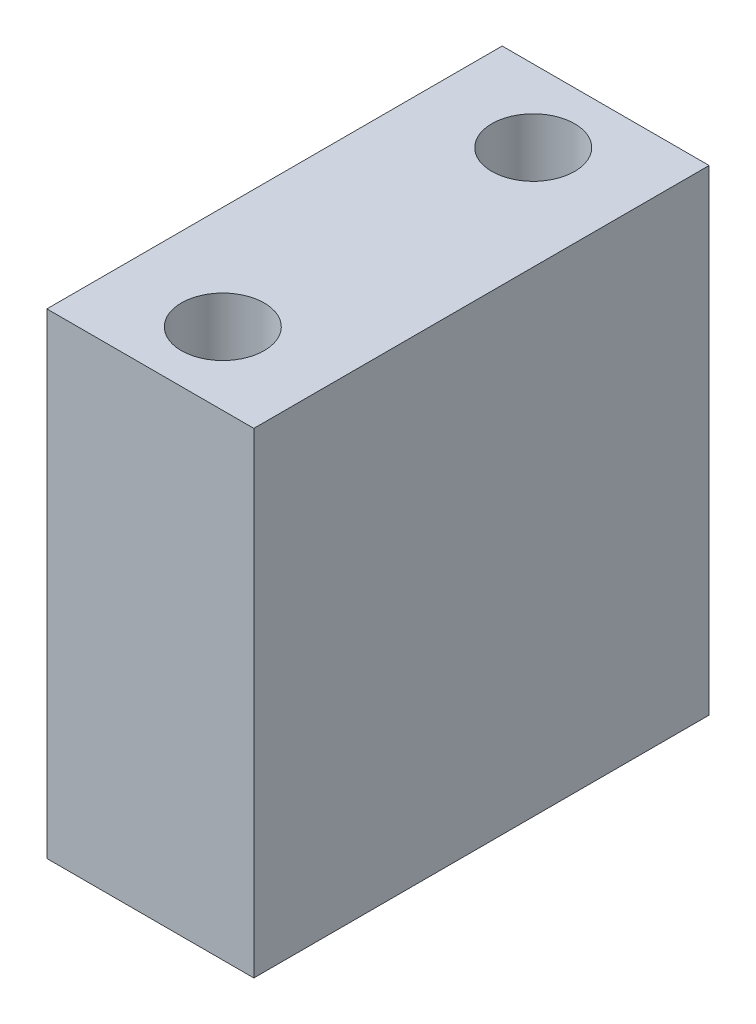
ISO-10303-21;
HEADER;
FILE_DESCRIPTION(('STEP AP214'),'2;1');
FILE_NAME('part.step','',(''),(''),'','','');
FILE_SCHEMA(('AUTOMOTIVE_DESIGN { 1 0 10303 214 1 1 1 1 }'));
ENDSEC;
DATA;
#1=APPLICATION_CONTEXT('core data for automotive mechanical design processes');
#2=APPLICATION_PROTOCOL_DEFINITION('international standard','automotive_design',2000,#1);
#3=PRODUCT_CONTEXT('',#1,'mechanical');
#4=PRODUCT('Part','Part','',(#3));
#5=PRODUCT_RELATED_PRODUCT_CATEGORY('part','',(#4));
#6=PRODUCT_DEFINITION_FORMATION('','',#4);
#7=PRODUCT_DEFINITION_CONTEXT('part definition',#1,'design');
#8=PRODUCT_DEFINITION('design','',#6,#7);
#9=PRODUCT_DEFINITION_SHAPE('','',#8);
#10=(LENGTH_UNIT() NAMED_UNIT(*) SI_UNIT(.MILLI.,.METRE.));
#11=(NAMED_UNIT(*) PLANE_ANGLE_UNIT() SI_UNIT($,.RADIAN.));
#12=(NAMED_UNIT(*) SI_UNIT($,.STERADIAN.) SOLID_ANGLE_UNIT());
#13=UNCERTAINTY_MEASURE_WITH_UNIT(LENGTH_MEASURE(1.E-05),#10,'distance_accuracy_value','');
#14=(GEOMETRIC_REPRESENTATION_CONTEXT(3) GLOBAL_UNCERTAINTY_ASSIGNED_CONTEXT((#13)) GLOBAL_UNIT_ASSIGNED_CONTEXT((#10,
#11,#12)) REPRESENTATION_CONTEXT('',''));
#15=CARTESIAN_POINT('',(0.,0.,0.));
#16=DIRECTION('',(0.,0.,1.));
#17=DIRECTION('',(1.,0.,0.));
#18=AXIS2_PLACEMENT_3D('',#15,#16,#17);
#19=CARTESIAN_POINT('',(0.,23.,0.));
#20=DIRECTION('',(0.,1.,0.));
#21=DIRECTION('',(0.,0.,1.));
#22=AXIS2_PLACEMENT_3D('',#19,#20,#21);
#23=PLANE('',#22);
#24=CARTESIAN_POINT('',(0.,23.,-7.49999999999999));
#25=DIRECTION('',(0.,1.,0.));
#26=DIRECTION('',(0.,0.,1.));
#27=AXIS2_PLACEMENT_3D('',#24,#25,#26);
#28=CIRCLE('',#27,2.);
#29=CARTESIAN_POINT('',(0.,23.,-5.49999999999999));
#30=VERTEX_POINT('',#29);
#31=EDGE_CURVE('E112',#30,#30,#28,.T.);
#32=ORIENTED_EDGE('',*,*,#31,.F.);
#33=EDGE_LOOP('',(#32));
#34=FACE_BOUND('',#33,.T.);
#35=DIRECTION('',(0.,0.,-1.));
#36=VECTOR('',#35,1.);
#37=CARTESIAN_POINT('',(5.,23.,-11.));
#38=LINE('',#37,#36);
#39=CARTESIAN_POINT('',(5.,23.,11.));
#40=VERTEX_POINT('',#39);
#41=CARTESIAN_POINT('',(5.,23.,-11.));
#42=VERTEX_POINT('',#41);
#43=EDGE_CURVE('E92',#40,#42,#38,.T.);
#44=ORIENTED_EDGE('',*,*,#43,.T.);
#45=DIRECTION('',(-1.,0.,0.));
#46=VECTOR('',#45,1.);
#47=CARTESIAN_POINT('',(-5.,23.,-11.));
#48=LINE('',#47,#46);
#49=CARTESIAN_POINT('',(-5.,23.,-11.));
#50=VERTEX_POINT('',#49);
#51=EDGE_CURVE('E87',#42,#50,#48,.T.);
#52=ORIENTED_EDGE('',*,*,#51,.T.);
#53=DIRECTION('',(0.,0.,1.));
#54=VECTOR('',#53,1.);
#55=CARTESIAN_POINT('',(-5.,23.,-11.));
#56=LINE('',#55,#54);
#57=CARTESIAN_POINT('',(-5.,23.,11.));
#58=VERTEX_POINT('',#57);
#59=EDGE_CURVE('E90',#50,#58,#56,.T.);
#60=ORIENTED_EDGE('',*,*,#59,.T.);
#61=DIRECTION('',(1.,0.,0.));
#62=VECTOR('',#61,1.);
#63=CARTESIAN_POINT('',(-5.,23.,11.));
#64=LINE('',#63,#62);
#65=EDGE_CURVE('E57',#58,#40,#64,.T.);
#66=ORIENTED_EDGE('',*,*,#65,.T.);
#67=EDGE_LOOP('',(#44,#52,#60,#66));
#68=FACE_BOUND('',#67,.T.);
#69=CARTESIAN_POINT('',(0.,23.,7.5));
#70=DIRECTION('',(0.,1.,0.));
#71=DIRECTION('',(0.,0.,1.));
#72=AXIS2_PLACEMENT_3D('',#69,#70,#71);
#73=CIRCLE('',#72,2.);
#74=CARTESIAN_POINT('',(0.,23.,9.5));
#75=VERTEX_POINT('',#74);
#76=EDGE_CURVE('E134',#75,#75,#73,.T.);
#77=ORIENTED_EDGE('',*,*,#76,.F.);
#78=EDGE_LOOP('',(#77));
#79=FACE_BOUND('',#78,.T.);
#80=ADVANCED_FACE('F39',(#34,#68,#79),#23,.T.);
#81=CARTESIAN_POINT('',(0.,0.,0.));
#82=DIRECTION('',(0.,1.,0.));
#83=DIRECTION('',(0.,0.,1.));
#84=AXIS2_PLACEMENT_3D('',#81,#82,#83);
#85=PLANE('',#84);
#86=DIRECTION('',(0.,0.,-1.));
#87=VECTOR('',#86,1.);
#88=CARTESIAN_POINT('',(5.,0.,-11.));
#89=LINE('',#88,#87);
#90=CARTESIAN_POINT('',(5.,0.,11.));
#91=VERTEX_POINT('',#90);
#92=CARTESIAN_POINT('',(5.,0.,-11.));
#93=VERTEX_POINT('',#92);
#94=EDGE_CURVE('E108',#91,#93,#89,.T.);
#95=ORIENTED_EDGE('',*,*,#94,.F.);
#96=DIRECTION('',(1.,0.,0.));
#97=VECTOR('',#96,1.);
#98=CARTESIAN_POINT('',(-5.,0.,11.));
#99=LINE('',#98,#97);
#100=CARTESIAN_POINT('',(-5.,0.,11.));
#101=VERTEX_POINT('',#100);
#102=EDGE_CURVE('E80',#101,#91,#99,.T.);
#103=ORIENTED_EDGE('',*,*,#102,.F.);
#104=DIRECTION('',(0.,0.,1.));
#105=VECTOR('',#104,1.);
#106=CARTESIAN_POINT('',(-5.,0.,-11.));
#107=LINE('',#106,#105);
#108=CARTESIAN_POINT('',(-5.,0.,-11.));
#109=VERTEX_POINT('',#108);
#110=EDGE_CURVE('E74',#109,#101,#107,.T.);
#111=ORIENTED_EDGE('',*,*,#110,.F.);
#112=DIRECTION('',(-1.,0.,0.));
#113=VECTOR('',#112,1.);
#114=CARTESIAN_POINT('',(-5.,0.,-11.));
#115=LINE('',#114,#113);
#116=EDGE_CURVE('E97',#93,#109,#115,.T.);
#117=ORIENTED_EDGE('',*,*,#116,.F.);
#118=EDGE_LOOP('',(#95,#103,#111,#117));
#119=FACE_BOUND('',#118,.T.);
#120=CARTESIAN_POINT('',(0.,0.,-7.49999999999999));
#121=DIRECTION('',(0.,1.,0.));
#122=DIRECTION('',(0.,0.,1.));
#123=AXIS2_PLACEMENT_3D('',#120,#121,#122);
#124=CIRCLE('',#123,2.);
#125=CARTESIAN_POINT('',(0.,0.,-5.49999999999999));
#126=VERTEX_POINT('',#125);
#127=EDGE_CURVE('E130',#126,#126,#124,.T.);
#128=ORIENTED_EDGE('',*,*,#127,.T.);
#129=EDGE_LOOP('',(#128));
#130=FACE_BOUND('',#129,.T.);
#131=CARTESIAN_POINT('',(0.,0.,7.5));
#132=DIRECTION('',(0.,1.,0.));
#133=DIRECTION('',(0.,0.,1.));
#134=AXIS2_PLACEMENT_3D('',#131,#132,#133);
#135=CIRCLE('',#134,2.);
#136=CARTESIAN_POINT('',(0.,0.,9.5));
#137=VERTEX_POINT('',#136);
#138=EDGE_CURVE('E138',#137,#137,#135,.T.);
#139=ORIENTED_EDGE('',*,*,#138,.T.);
#140=EDGE_LOOP('',(#139));
#141=FACE_BOUND('',#140,.T.);
#142=ADVANCED_FACE('F125',(#119,#130,#141),#85,.F.);
#143=CARTESIAN_POINT('',(5.,23.,-11.));
#144=DIRECTION('',(-1.,0.,0.));
#145=DIRECTION('',(0.,0.,1.));
#146=AXIS2_PLACEMENT_3D('',#143,#144,#145);
#147=PLANE('',#146);
#148=ORIENTED_EDGE('',*,*,#94,.T.);
#149=DIRECTION('',(0.,-1.,0.));
#150=VECTOR('',#149,1.);
#151=CARTESIAN_POINT('',(5.,23.,-11.));
#152=LINE('',#151,#150);
#153=EDGE_CURVE('E11',#42,#93,#152,.T.);
#154=ORIENTED_EDGE('',*,*,#153,.F.);
#155=ORIENTED_EDGE('',*,*,#43,.F.);
#156=DIRECTION('',(0.,-1.,0.));
#157=VECTOR('',#156,1.);
#158=CARTESIAN_POINT('',(5.,23.,11.));
#159=LINE('',#158,#157);
#160=EDGE_CURVE('E104',#40,#91,#159,.T.);
#161=ORIENTED_EDGE('',*,*,#160,.T.);
#162=EDGE_LOOP('',(#148,#154,#155,#161));
#163=FACE_BOUND('',#162,.T.);
#164=ADVANCED_FACE('F41',(#163),#147,.F.);
#165=CARTESIAN_POINT('',(-5.,23.,-11.));
#166=DIRECTION('',(0.,0.,1.));
#167=DIRECTION('',(1.,0.,0.));
#168=AXIS2_PLACEMENT_3D('',#165,#166,#167);
#169=PLANE('',#168);
#170=ORIENTED_EDGE('',*,*,#116,.T.);
#171=DIRECTION('',(0.,-1.,0.));
#172=VECTOR('',#171,1.);
#173=CARTESIAN_POINT('',(-5.,23.,-11.));
#174=LINE('',#173,#172);
#175=EDGE_CURVE('E49',#50,#109,#174,.T.);
#176=ORIENTED_EDGE('',*,*,#175,.F.);
#177=ORIENTED_EDGE('',*,*,#51,.F.);
#178=ORIENTED_EDGE('',*,*,#153,.T.);
#179=EDGE_LOOP('',(#170,#176,#177,#178));
#180=FACE_BOUND('',#179,.T.);
#181=ADVANCED_FACE('F96',(#180),#169,.F.);
#182=CARTESIAN_POINT('',(-5.,23.,-11.));
#183=DIRECTION('',(1.,0.,0.));
#184=DIRECTION('',(0.,0.,-1.));
#185=AXIS2_PLACEMENT_3D('',#182,#183,#184);
#186=PLANE('',#185);
#187=ORIENTED_EDGE('',*,*,#110,.T.);
#188=DIRECTION('',(0.,-1.,0.));
#189=VECTOR('',#188,1.);
#190=CARTESIAN_POINT('',(-5.,23.,11.));
#191=LINE('',#190,#189);
#192=EDGE_CURVE('E99',#58,#101,#191,.T.);
#193=ORIENTED_EDGE('',*,*,#192,.F.);
#194=ORIENTED_EDGE('',*,*,#59,.F.);
#195=ORIENTED_EDGE('',*,*,#175,.T.);
#196=EDGE_LOOP('',(#187,#193,#194,#195));
#197=FACE_BOUND('',#196,.T.);
#198=ADVANCED_FACE('F100',(#197),#186,.F.);
#199=CARTESIAN_POINT('',(-5.,23.,11.));
#200=DIRECTION('',(0.,0.,-1.));
#201=DIRECTION('',(-1.,0.,0.));
#202=AXIS2_PLACEMENT_3D('',#199,#200,#201);
#203=PLANE('',#202);
#204=ORIENTED_EDGE('',*,*,#102,.T.);
#205=ORIENTED_EDGE('',*,*,#160,.F.);
#206=ORIENTED_EDGE('',*,*,#65,.F.);
#207=ORIENTED_EDGE('',*,*,#192,.T.);
#208=EDGE_LOOP('',(#204,#205,#206,#207));
#209=FACE_BOUND('',#208,.T.);
#210=ADVANCED_FACE('F122',(#209),#203,.F.);
#211=CARTESIAN_POINT('',(0.,23.,-7.49999999999999));
#212=DIRECTION('',(0.,-1.,0.));
#213=DIRECTION('',(0.,0.,-1.));
#214=AXIS2_PLACEMENT_3D('',#211,#212,#213);
#215=CYLINDRICAL_SURFACE('',#214,2.);
#216=ORIENTED_EDGE('',*,*,#31,.T.);
#217=EDGE_LOOP('',(#216));
#218=FACE_BOUND('',#217,.T.);
#219=ORIENTED_EDGE('',*,*,#127,.F.);
#220=EDGE_LOOP('',(#219));
#221=FACE_BOUND('',#220,.T.);
#222=ADVANCED_FACE('F157',(#218,#221),#215,.F.);
#223=CARTESIAN_POINT('',(0.,23.,7.5));
#224=DIRECTION('',(0.,-1.,0.));
#225=DIRECTION('',(0.,0.,-1.));
#226=AXIS2_PLACEMENT_3D('',#223,#224,#225);
#227=CYLINDRICAL_SURFACE('',#226,2.);
#228=ORIENTED_EDGE('',*,*,#76,.T.);
#229=EDGE_LOOP('',(#228));
#230=FACE_BOUND('',#229,.T.);
#231=ORIENTED_EDGE('',*,*,#138,.F.);
#232=EDGE_LOOP('',(#231));
#233=FACE_BOUND('',#232,.T.);
#234=ADVANCED_FACE('F146',(#230,#233),#227,.F.);
#235=CLOSED_SHELL('',(#80,#142,#164,#181,#198,#210,#222,#234));
#236=MANIFOLD_SOLID_BREP('B2',#235);
#237=ADVANCED_BREP_SHAPE_REPRESENTATION('',(#18,#236),#14);
#238=SHAPE_DEFINITION_REPRESENTATION(#9,#237);
ENDSEC;
END-ISO-10303-21;
